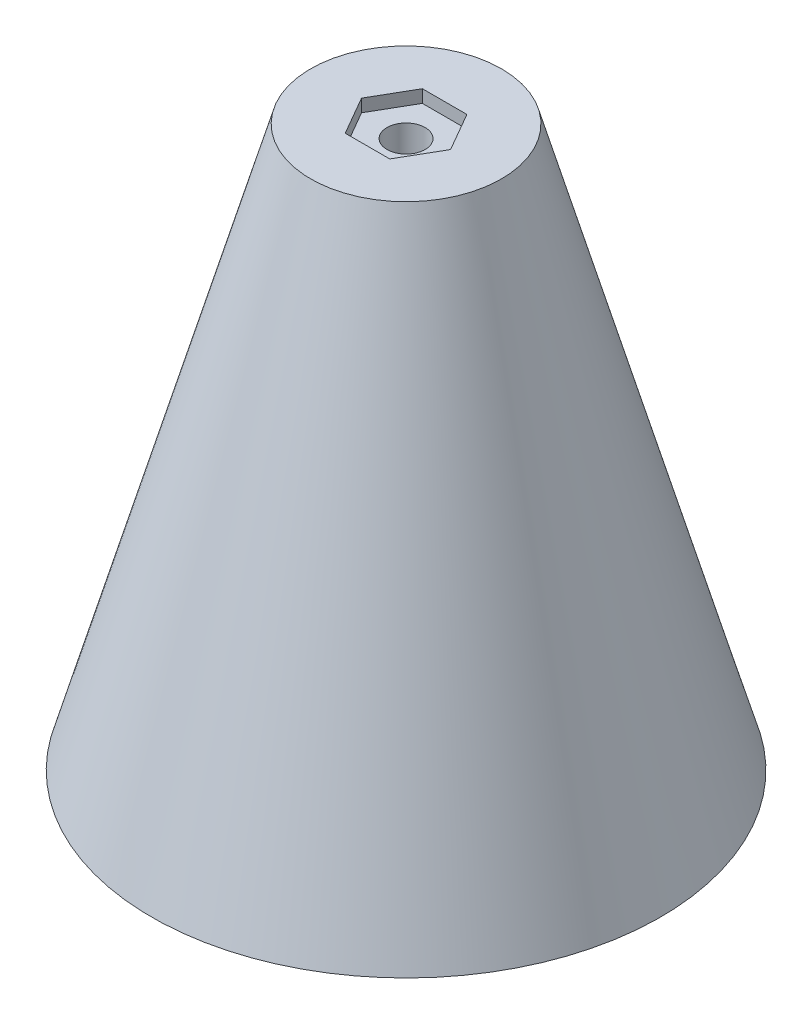
ISO-10303-21;
HEADER;
FILE_DESCRIPTION(('STEP AP214'),'2;1');
FILE_NAME('part.step','',(''),(''),'','','');
FILE_SCHEMA(('AUTOMOTIVE_DESIGN { 1 0 10303 214 1 1 1 1 }'));
ENDSEC;
DATA;
#1=APPLICATION_CONTEXT('core data for automotive mechanical design processes');
#2=APPLICATION_PROTOCOL_DEFINITION('international standard','automotive_design',2000,#1);
#3=PRODUCT_CONTEXT('',#1,'mechanical');
#4=PRODUCT('Part','Part','',(#3));
#5=PRODUCT_RELATED_PRODUCT_CATEGORY('part','',(#4));
#6=PRODUCT_DEFINITION_FORMATION('','',#4);
#7=PRODUCT_DEFINITION_CONTEXT('part definition',#1,'design');
#8=PRODUCT_DEFINITION('design','',#6,#7);
#9=PRODUCT_DEFINITION_SHAPE('','',#8);
#10=(LENGTH_UNIT() NAMED_UNIT(*) SI_UNIT(.MILLI.,.METRE.));
#11=(NAMED_UNIT(*) PLANE_ANGLE_UNIT() SI_UNIT($,.RADIAN.));
#12=(NAMED_UNIT(*) SI_UNIT($,.STERADIAN.) SOLID_ANGLE_UNIT());
#13=UNCERTAINTY_MEASURE_WITH_UNIT(LENGTH_MEASURE(1.E-05),#10,'distance_accuracy_value','');
#14=(GEOMETRIC_REPRESENTATION_CONTEXT(3) GLOBAL_UNCERTAINTY_ASSIGNED_CONTEXT((#13)) GLOBAL_UNIT_ASSIGNED_CONTEXT((#10,
#11,#12)) REPRESENTATION_CONTEXT('',''));
#15=CARTESIAN_POINT('',(0.,0.,0.));
#16=DIRECTION('',(0.,0.,1.));
#17=DIRECTION('',(1.,0.,0.));
#18=AXIS2_PLACEMENT_3D('',#15,#16,#17);
#19=CARTESIAN_POINT('',(0.,-10.,0.));
#20=DIRECTION('',(0.,1.,0.));
#21=DIRECTION('',(0.,0.,1.));
#22=AXIS2_PLACEMENT_3D('',#19,#20,#21);
#23=CYLINDRICAL_SURFACE('',#22,1.5);
#24=CARTESIAN_POINT('',(0.,-3.5,0.));
#25=DIRECTION('',(0.,1.,0.));
#26=DIRECTION('',(0.,0.,1.));
#27=AXIS2_PLACEMENT_3D('',#24,#25,#26);
#28=CIRCLE('',#27,1.5);
#29=CARTESIAN_POINT('',(0.,-3.5,1.5));
#30=VERTEX_POINT('',#29);
#31=EDGE_CURVE('E11',#30,#30,#28,.F.);
#32=ORIENTED_EDGE('',*,*,#31,.T.);
#33=EDGE_LOOP('',(#32));
#34=FACE_BOUND('',#33,.T.);
#35=CARTESIAN_POINT('',(0.,-0.999999999999999,0.));
#36=DIRECTION('',(0.,1.,0.));
#37=DIRECTION('',(0.,0.,1.));
#38=AXIS2_PLACEMENT_3D('',#35,#36,#37);
#39=CIRCLE('',#38,1.5);
#40=CARTESIAN_POINT('',(0.,-0.999999999999999,1.5));
#41=VERTEX_POINT('',#40);
#42=EDGE_CURVE('E42',#41,#41,#39,.F.);
#43=ORIENTED_EDGE('',*,*,#42,.F.);
#44=EDGE_LOOP('',(#43));
#45=FACE_BOUND('',#44,.T.);
#46=ADVANCED_FACE('F37',(#34,#45),#23,.F.);
#47=CARTESIAN_POINT('',(0.,0.,0.));
#48=DIRECTION('',(0.,-1.,0.));
#49=DIRECTION('',(0.,0.,-1.));
#50=AXIS2_PLACEMENT_3D('',#47,#48,#49);
#51=CONICAL_SURFACE('',#50,7.49999999999999,0.27679815863199);
#52=CARTESIAN_POINT('',(0.,-44.,0.));
#53=DIRECTION('',(0.,-1.,0.));
#54=DIRECTION('',(0.,0.,-1.));
#55=AXIS2_PLACEMENT_3D('',#52,#53,#54);
#56=CIRCLE('',#55,20.);
#57=CARTESIAN_POINT('',(0.,-44.,-20.));
#58=VERTEX_POINT('',#57);
#59=EDGE_CURVE('E147',#58,#58,#56,.T.);
#60=ORIENTED_EDGE('',*,*,#59,.F.);
#61=EDGE_LOOP('',(#60));
#62=FACE_BOUND('',#61,.T.);
#63=CARTESIAN_POINT('',(0.,0.,0.));
#64=DIRECTION('',(0.,-1.,0.));
#65=DIRECTION('',(0.,0.,-1.));
#66=AXIS2_PLACEMENT_3D('',#63,#64,#65);
#67=CIRCLE('',#66,7.49999999999999);
#68=CARTESIAN_POINT('',(0.,0.,-7.49999999999998));
#69=VERTEX_POINT('',#68);
#70=EDGE_CURVE('E156',#69,#69,#67,.T.);
#71=ORIENTED_EDGE('',*,*,#70,.T.);
#72=EDGE_LOOP('',(#71));
#73=FACE_BOUND('',#72,.T.);
#74=ADVANCED_FACE('F179',(#62,#73),#51,.T.);
#75=CARTESIAN_POINT('',(0.,0.,7.5));
#76=DIRECTION('',(0.,-1.,0.));
#77=DIRECTION('',(0.,0.,-1.));
#78=AXIS2_PLACEMENT_3D('',#75,#76,#77);
#79=PLANE('',#78);
#80=DIRECTION('',(-0.5,0.,-0.866025403784439));
#81=VECTOR('',#80,1.);
#82=CARTESIAN_POINT('',(3.5,0.,0.));
#83=LINE('',#82,#81);
#84=CARTESIAN_POINT('',(3.5,0.,0.));
#85=VERTEX_POINT('',#84);
#86=CARTESIAN_POINT('',(1.75,0.,-3.03108891324554));
#87=VERTEX_POINT('',#86);
#88=EDGE_CURVE('E129',#85,#87,#83,.T.);
#89=ORIENTED_EDGE('',*,*,#88,.F.);
#90=DIRECTION('',(0.5,0.,-0.866025403784439));
#91=VECTOR('',#90,1.);
#92=CARTESIAN_POINT('',(1.75,0.,3.03108891324554));
#93=LINE('',#92,#91);
#94=CARTESIAN_POINT('',(1.75,0.,3.03108891324554));
#95=VERTEX_POINT('',#94);
#96=EDGE_CURVE('E54',#95,#85,#93,.T.);
#97=ORIENTED_EDGE('',*,*,#96,.F.);
#98=DIRECTION('',(1.,0.,0.));
#99=VECTOR('',#98,1.);
#100=CARTESIAN_POINT('',(-1.75,0.,3.03108891324554));
#101=LINE('',#100,#99);
#102=CARTESIAN_POINT('',(-1.75,0.,3.03108891324554));
#103=VERTEX_POINT('',#102);
#104=EDGE_CURVE('E138',#103,#95,#101,.T.);
#105=ORIENTED_EDGE('',*,*,#104,.F.);
#106=DIRECTION('',(0.5,0.,0.866025403784439));
#107=VECTOR('',#106,1.);
#108=CARTESIAN_POINT('',(-3.5,0.,0.));
#109=LINE('',#108,#107);
#110=CARTESIAN_POINT('',(-3.5,0.,0.));
#111=VERTEX_POINT('',#110);
#112=EDGE_CURVE('E136',#111,#103,#109,.T.);
#113=ORIENTED_EDGE('',*,*,#112,.F.);
#114=DIRECTION('',(-0.5,0.,0.866025403784439));
#115=VECTOR('',#114,1.);
#116=CARTESIAN_POINT('',(-1.75,0.,-3.03108891324554));
#117=LINE('',#116,#115);
#118=CARTESIAN_POINT('',(-1.75,0.,-3.03108891324554));
#119=VERTEX_POINT('',#118);
#120=EDGE_CURVE('E102',#119,#111,#117,.T.);
#121=ORIENTED_EDGE('',*,*,#120,.F.);
#122=DIRECTION('',(-1.,0.,0.));
#123=VECTOR('',#122,1.);
#124=CARTESIAN_POINT('',(1.75,0.,-3.03108891324554));
#125=LINE('',#124,#123);
#126=EDGE_CURVE('E132',#87,#119,#125,.T.);
#127=ORIENTED_EDGE('',*,*,#126,.F.);
#128=EDGE_LOOP('',(#89,#97,#105,#113,#121,#127));
#129=FACE_BOUND('',#128,.T.);
#130=ORIENTED_EDGE('',*,*,#70,.F.);
#131=EDGE_LOOP('',(#130));
#132=FACE_BOUND('',#131,.T.);
#133=ADVANCED_FACE('F185',(#129,#132),#79,.F.);
#134=CARTESIAN_POINT('',(0.,-4.,0.));
#135=DIRECTION('',(0.,1.,0.));
#136=DIRECTION('',(0.,0.,1.));
#137=AXIS2_PLACEMENT_3D('',#134,#135,#136);
#138=PLANE('',#137);
#139=CARTESIAN_POINT('',(0.,-4.,0.));
#140=DIRECTION('',(0.,1.,0.));
#141=DIRECTION('',(0.,0.,1.));
#142=AXIS2_PLACEMENT_3D('',#139,#140,#141);
#143=CIRCLE('',#142,1.99999999999999);
#144=CARTESIAN_POINT('',(0.,-4.,2.));
#145=VERTEX_POINT('',#144);
#146=EDGE_CURVE('E47',#145,#145,#143,.T.);
#147=ORIENTED_EDGE('',*,*,#146,.T.);
#148=EDGE_LOOP('',(#147));
#149=FACE_BOUND('',#148,.T.);
#150=CARTESIAN_POINT('',(0.,-4.,0.));
#151=DIRECTION('',(0.,-1.,0.));
#152=DIRECTION('',(0.,0.,-1.));
#153=AXIS2_PLACEMENT_3D('',#150,#151,#152);
#154=CIRCLE('',#153,4.63636363636363);
#155=CARTESIAN_POINT('',(0.,-4.,-4.63636363636362));
#156=VERTEX_POINT('',#155);
#157=EDGE_CURVE('E153',#156,#156,#154,.T.);
#158=ORIENTED_EDGE('',*,*,#157,.T.);
#159=EDGE_LOOP('',(#158));
#160=FACE_BOUND('',#159,.T.);
#161=ADVANCED_FACE('F162',(#149,#160),#138,.F.);
#162=CARTESIAN_POINT('',(0.,-44.,0.));
#163=DIRECTION('',(0.,-1.,0.));
#164=DIRECTION('',(0.,0.,-1.));
#165=AXIS2_PLACEMENT_3D('',#162,#163,#164);
#166=CONICAL_SURFACE('',#165,16.,0.27679815863199);
#167=CARTESIAN_POINT('',(0.,-44.,0.));
#168=DIRECTION('',(0.,-1.,0.));
#169=DIRECTION('',(0.,0.,-1.));
#170=AXIS2_PLACEMENT_3D('',#167,#168,#169);
#171=CIRCLE('',#170,16.);
#172=CARTESIAN_POINT('',(0.,-44.,-16.));
#173=VERTEX_POINT('',#172);
#174=EDGE_CURVE('E150',#173,#173,#171,.T.);
#175=CARTESIAN_POINT('',(0.,-4.,-4.63636363636362));
#176=CARTESIAN_POINT('',(0.,-4.41666666666667,-4.75473484848483));
#177=CARTESIAN_POINT('',(0.,-4.83333333333334,-4.87310606060604));
#178=CARTESIAN_POINT('',(0.,-5.66666666666667,-5.10984848484847));
#179=CARTESIAN_POINT('',(0.,-6.08333333333334,-5.22821969696968));
#180=CARTESIAN_POINT('',(0.,-6.91666666666667,-5.4649621212121));
#181=CARTESIAN_POINT('',(0.,-7.33333333333333,-5.58333333333332));
#182=CARTESIAN_POINT('',(0.,-8.16666666666667,-5.82007575757574));
#183=CARTESIAN_POINT('',(0.,-8.58333333333333,-5.93844696969695));
#184=CARTESIAN_POINT('',(0.,-9.41666666666667,-6.17518939393937));
#185=CARTESIAN_POINT('',(0.,-9.83333333333333,-6.29356060606059));
#186=CARTESIAN_POINT('',(0.,-10.6666666666667,-6.53030303030301));
#187=CARTESIAN_POINT('',(0.,-11.0833333333333,-6.64867424242422));
#188=CARTESIAN_POINT('',(0.,-11.9166666666667,-6.88541666666665));
#189=CARTESIAN_POINT('',(0.,-12.3333333333333,-7.00378787878786));
#190=CARTESIAN_POINT('',(0.,-13.1666666666667,-7.24053030303028));
#191=CARTESIAN_POINT('',(0.,-13.5833333333333,-7.35890151515149));
#192=CARTESIAN_POINT('',(0.,-14.4166666666667,-7.59564393939392));
#193=CARTESIAN_POINT('',(0.,-14.8333333333333,-7.71401515151513));
#194=CARTESIAN_POINT('',(0.,-15.6666666666667,-7.95075757575755));
#195=CARTESIAN_POINT('',(0.,-16.0833333333333,-8.06912878787876));
#196=CARTESIAN_POINT('',(0.,-16.9166666666667,-8.30587121212119));
#197=CARTESIAN_POINT('',(0.,-17.3333333333333,-8.4242424242424));
#198=CARTESIAN_POINT('',(0.,-18.1666666666667,-8.66098484848482));
#199=CARTESIAN_POINT('',(0.,-18.5833333333333,-8.77935606060604));
#200=CARTESIAN_POINT('',(0.,-19.4166666666667,-9.01609848484846));
#201=CARTESIAN_POINT('',(0.,-19.8333333333333,-9.13446969696967));
#202=CARTESIAN_POINT('',(0.,-20.6666666666667,-9.37121212121209));
#203=CARTESIAN_POINT('',(0.,-21.0833333333333,-9.48958333333331));
#204=CARTESIAN_POINT('',(0.,-21.9166666666667,-9.72632575757573));
#205=CARTESIAN_POINT('',(0.,-22.3333333333333,-9.84469696969694));
#206=CARTESIAN_POINT('',(0.,-23.1666666666667,-10.0814393939394));
#207=CARTESIAN_POINT('',(0.,-23.5833333333333,-10.1998106060606));
#208=CARTESIAN_POINT('',(0.,-24.4166666666667,-10.436553030303));
#209=CARTESIAN_POINT('',(0.,-24.8333333333333,-10.5549242424242));
#210=CARTESIAN_POINT('',(0.,-25.6666666666667,-10.7916666666666));
#211=CARTESIAN_POINT('',(0.,-26.0833333333333,-10.9100378787878));
#212=CARTESIAN_POINT('',(0.,-26.9166666666667,-11.1467803030303));
#213=CARTESIAN_POINT('',(0.,-27.3333333333333,-11.2651515151515));
#214=CARTESIAN_POINT('',(0.,-28.1666666666667,-11.5018939393939));
#215=CARTESIAN_POINT('',(0.,-28.5833333333333,-11.6202651515151));
#216=CARTESIAN_POINT('',(0.,-29.4166666666667,-11.8570075757575));
#217=CARTESIAN_POINT('',(0.,-29.8333333333333,-11.9753787878788));
#218=CARTESIAN_POINT('',(0.,-30.6666666666667,-12.2121212121212));
#219=CARTESIAN_POINT('',(0.,-31.0833333333333,-12.3304924242424));
#220=CARTESIAN_POINT('',(0.,-31.9166666666667,-12.5672348484848));
#221=CARTESIAN_POINT('',(0.,-32.3333333333333,-12.685606060606));
#222=CARTESIAN_POINT('',(0.,-33.1666666666667,-12.9223484848484));
#223=CARTESIAN_POINT('',(0.,-33.5833333333333,-13.0407196969697));
#224=CARTESIAN_POINT('',(0.,-34.4166666666667,-13.2774621212121));
#225=CARTESIAN_POINT('',(0.,-34.8333333333333,-13.3958333333333));
#226=CARTESIAN_POINT('',(0.,-35.6666666666667,-13.6325757575757));
#227=CARTESIAN_POINT('',(0.,-36.0833333333333,-13.7509469696969));
#228=CARTESIAN_POINT('',(0.,-36.9166666666667,-13.9876893939394));
#229=CARTESIAN_POINT('',(0.,-37.3333333333333,-14.1060606060606));
#230=CARTESIAN_POINT('',(0.,-38.1666666666667,-14.342803030303));
#231=CARTESIAN_POINT('',(0.,-38.5833333333333,-14.4611742424242));
#232=CARTESIAN_POINT('',(0.,-39.4166666666667,-14.6979166666666));
#233=CARTESIAN_POINT('',(0.,-39.8333333333333,-14.8162878787878));
#234=CARTESIAN_POINT('',(0.,-40.6666666666667,-15.0530303030303));
#235=CARTESIAN_POINT('',(0.,-41.0833333333333,-15.1714015151515));
#236=CARTESIAN_POINT('',(0.,-41.9166666666667,-15.4081439393939));
#237=CARTESIAN_POINT('',(0.,-42.3333333333333,-15.5265151515151));
#238=CARTESIAN_POINT('',(0.,-43.1666666666667,-15.7632575757575));
#239=CARTESIAN_POINT('',(0.,-43.5833333333333,-15.8816287878787));
#240=CARTESIAN_POINT('',(0.,-44.,-16.));
#241=B_SPLINE_CURVE_WITH_KNOTS('',3,(#175,#176,#177,#178,#179,#180,#181,#182,#183,#184,#185,
#186,#187,#188,#189,#190,#191,#192,#193,#194,#195,#196,#197,#198,#199,#200,#201,#202,#203,#204,
#205,#206,#207,#208,#209,#210,#211,#212,#213,#214,#215,#216,#217,#218,#219,#220,#221,#222,#223,
#224,#225,#226,#227,#228,#229,#230,#231,#232,#233,#234,#235,#236,#237,#238,#239,#240),
.UNSPECIFIED.,.F.,.F.,(4,2,2,2,2,2,2,2,2,2,2,2,2,2,2,2,2,2,2,2,2,2,2,2,2,2,2,2,2,2,2,2,4),(0.,
1.29946361808687,2.59892723617373,3.89839085426059,5.19785447234746,6.49731809043432,
7.79678170852119,9.09624532660805,10.3957089446949,11.6951725627818,12.9946361808686,
14.2940997989555,15.5935634170424,16.8930270351292,18.1924906532161,19.491954271303,
20.7914178893898,22.0908815074767,23.3903451255636,24.6898087436504,25.9892723617373,
27.2887359798242,28.588199597911,29.8876632159979,31.1871268340847,32.4865904521716,
33.7860540702585,35.0855176883453,36.3849813064322,37.6844449245191,38.9839085426059,
40.2833721606928,41.5828357787797),.UNSPECIFIED.);
#242=EDGE_CURVE('BSEAM174',#156,#173,#241,.T.);
#243=ORIENTED_EDGE('',*,*,#157,.F.);
#244=ORIENTED_EDGE('',*,*,#174,.T.);
#245=ORIENTED_EDGE('',*,*,#242,.T.);
#246=ORIENTED_EDGE('',*,*,#242,.F.);
#247=EDGE_LOOP('',(#243,#245,#244,#246));
#248=FACE_BOUND('',#247,.T.);
#249=ADVANCED_FACE('F174',(#248),#166,.F.);
#250=CARTESIAN_POINT('',(0.,-44.,16.));
#251=DIRECTION('',(0.,1.,0.));
#252=DIRECTION('',(0.,0.,1.));
#253=AXIS2_PLACEMENT_3D('',#250,#251,#252);
#254=PLANE('',#253);
#255=ORIENTED_EDGE('',*,*,#174,.F.);
#256=EDGE_LOOP('',(#255));
#257=FACE_BOUND('',#256,.T.);
#258=ORIENTED_EDGE('',*,*,#59,.T.);
#259=EDGE_LOOP('',(#258));
#260=FACE_BOUND('',#259,.T.);
#261=ADVANCED_FACE('F166',(#257,#260),#254,.F.);
#262=CARTESIAN_POINT('',(0.,-4.,0.));
#263=DIRECTION('',(0.,-1.,0.));
#264=DIRECTION('',(0.,0.,-1.));
#265=AXIS2_PLACEMENT_3D('',#262,#263,#264);
#266=CONICAL_SURFACE('',#265,1.99999999999999,0.78539816339744);
#267=ORIENTED_EDGE('',*,*,#31,.F.);
#268=EDGE_LOOP('',(#267));
#269=FACE_BOUND('',#268,.T.);
#270=ORIENTED_EDGE('',*,*,#146,.F.);
#271=EDGE_LOOP('',(#270));
#272=FACE_BOUND('',#271,.T.);
#273=ADVANCED_FACE('F40',(#269,#272),#266,.F.);
#274=CARTESIAN_POINT('',(0.,-1.,0.));
#275=DIRECTION('',(0.,1.,0.));
#276=DIRECTION('',(0.,0.,1.));
#277=AXIS2_PLACEMENT_3D('',#274,#275,#276);
#278=PLANE('',#277);
#279=DIRECTION('',(0.5,0.,-0.866025403784439));
#280=VECTOR('',#279,1.);
#281=CARTESIAN_POINT('',(1.75,-0.999999999999999,3.03108891324554));
#282=LINE('',#281,#280);
#283=CARTESIAN_POINT('',(1.75,-0.999999999999999,3.03108891324554));
#284=VERTEX_POINT('',#283);
#285=CARTESIAN_POINT('',(3.5,-1.,0.));
#286=VERTEX_POINT('',#285);
#287=EDGE_CURVE('E140',#284,#286,#282,.T.);
#288=ORIENTED_EDGE('',*,*,#287,.T.);
#289=DIRECTION('',(-0.5,0.,-0.866025403784439));
#290=VECTOR('',#289,1.);
#291=CARTESIAN_POINT('',(3.5,-1.,0.));
#292=LINE('',#291,#290);
#293=CARTESIAN_POINT('',(1.75,-1.,-3.03108891324554));
#294=VERTEX_POINT('',#293);
#295=EDGE_CURVE('E123',#286,#294,#292,.T.);
#296=ORIENTED_EDGE('',*,*,#295,.T.);
#297=DIRECTION('',(-1.,0.,0.));
#298=VECTOR('',#297,1.);
#299=CARTESIAN_POINT('',(1.75,-1.,-3.03108891324554));
#300=LINE('',#299,#298);
#301=CARTESIAN_POINT('',(-1.75,-1.,-3.03108891324554));
#302=VERTEX_POINT('',#301);
#303=EDGE_CURVE('E121',#294,#302,#300,.T.);
#304=ORIENTED_EDGE('',*,*,#303,.T.);
#305=DIRECTION('',(-0.5,0.,0.866025403784439));
#306=VECTOR('',#305,1.);
#307=CARTESIAN_POINT('',(-1.75,-1.,-3.03108891324554));
#308=LINE('',#307,#306);
#309=CARTESIAN_POINT('',(-3.5,-1.,0.));
#310=VERTEX_POINT('',#309);
#311=EDGE_CURVE('E99',#302,#310,#308,.T.);
#312=ORIENTED_EDGE('',*,*,#311,.T.);
#313=DIRECTION('',(0.5,0.,0.866025403784439));
#314=VECTOR('',#313,1.);
#315=CARTESIAN_POINT('',(-3.5,-1.,0.));
#316=LINE('',#315,#314);
#317=CARTESIAN_POINT('',(-1.75,-0.999999999999999,3.03108891324554));
#318=VERTEX_POINT('',#317);
#319=EDGE_CURVE('E110',#310,#318,#316,.T.);
#320=ORIENTED_EDGE('',*,*,#319,.T.);
#321=DIRECTION('',(1.,0.,0.));
#322=VECTOR('',#321,1.);
#323=CARTESIAN_POINT('',(-1.75,-0.999999999999999,3.03108891324554));
#324=LINE('',#323,#322);
#325=EDGE_CURVE('E114',#318,#284,#324,.T.);
#326=ORIENTED_EDGE('',*,*,#325,.T.);
#327=EDGE_LOOP('',(#288,#296,#304,#312,#320,#326));
#328=FACE_BOUND('',#327,.T.);
#329=ORIENTED_EDGE('',*,*,#42,.T.);
#330=EDGE_LOOP('',(#329));
#331=FACE_BOUND('',#330,.T.);
#332=ADVANCED_FACE('F117',(#328,#331),#278,.T.);
#333=CARTESIAN_POINT('',(1.75,-0.999999999999999,3.03108891324554));
#334=DIRECTION('',(0.866025403784439,0.,0.5));
#335=DIRECTION('',(0.5,0.,-0.866025403784439));
#336=AXIS2_PLACEMENT_3D('',#333,#334,#335);
#337=PLANE('',#336);
#338=ORIENTED_EDGE('',*,*,#96,.T.);
#339=DIRECTION('',(0.,1.,0.));
#340=VECTOR('',#339,1.);
#341=CARTESIAN_POINT('',(3.5,-1.,0.));
#342=LINE('',#341,#340);
#343=EDGE_CURVE('E84',#286,#85,#342,.T.);
#344=ORIENTED_EDGE('',*,*,#343,.F.);
#345=ORIENTED_EDGE('',*,*,#287,.F.);
#346=DIRECTION('',(0.,1.,0.));
#347=VECTOR('',#346,1.);
#348=CARTESIAN_POINT('',(1.75,-0.999999999999999,3.03108891324554));
#349=LINE('',#348,#347);
#350=EDGE_CURVE('E62',#284,#95,#349,.T.);
#351=ORIENTED_EDGE('',*,*,#350,.T.);
#352=EDGE_LOOP('',(#338,#344,#345,#351));
#353=FACE_BOUND('',#352,.T.);
#354=ADVANCED_FACE('F172',(#353),#337,.F.);
#355=CARTESIAN_POINT('',(-1.75,-0.999999999999999,3.03108891324554));
#356=DIRECTION('',(0.,0.,1.));
#357=DIRECTION('',(0.,-1.,0.));
#358=AXIS2_PLACEMENT_3D('',#355,#356,#357);
#359=PLANE('',#358);
#360=ORIENTED_EDGE('',*,*,#104,.T.);
#361=ORIENTED_EDGE('',*,*,#350,.F.);
#362=ORIENTED_EDGE('',*,*,#325,.F.);
#363=DIRECTION('',(0.,1.,0.));
#364=VECTOR('',#363,1.);
#365=CARTESIAN_POINT('',(-1.75,-0.999999999999999,3.03108891324554));
#366=LINE('',#365,#364);
#367=EDGE_CURVE('E106',#318,#103,#366,.T.);
#368=ORIENTED_EDGE('',*,*,#367,.T.);
#369=EDGE_LOOP('',(#360,#361,#362,#368));
#370=FACE_BOUND('',#369,.T.);
#371=ADVANCED_FACE('F210',(#370),#359,.F.);
#372=CARTESIAN_POINT('',(-3.5,-1.,0.));
#373=DIRECTION('',(-0.866025403784439,0.,0.5));
#374=DIRECTION('',(0.5,0.,0.866025403784439));
#375=AXIS2_PLACEMENT_3D('',#372,#373,#374);
#376=PLANE('',#375);
#377=ORIENTED_EDGE('',*,*,#112,.T.);
#378=ORIENTED_EDGE('',*,*,#367,.F.);
#379=ORIENTED_EDGE('',*,*,#319,.F.);
#380=DIRECTION('',(0.,1.,0.));
#381=VECTOR('',#380,1.);
#382=CARTESIAN_POINT('',(-3.5,-1.,0.));
#383=LINE('',#382,#381);
#384=EDGE_CURVE('E95',#310,#111,#383,.T.);
#385=ORIENTED_EDGE('',*,*,#384,.T.);
#386=EDGE_LOOP('',(#377,#378,#379,#385));
#387=FACE_BOUND('',#386,.T.);
#388=ADVANCED_FACE('F111',(#387),#376,.F.);
#389=CARTESIAN_POINT('',(-1.75,-1.,-3.03108891324554));
#390=DIRECTION('',(-0.866025403784439,0.,-0.5));
#391=DIRECTION('',(-0.5,0.,0.866025403784439));
#392=AXIS2_PLACEMENT_3D('',#389,#390,#391);
#393=PLANE('',#392);
#394=ORIENTED_EDGE('',*,*,#120,.T.);
#395=ORIENTED_EDGE('',*,*,#384,.F.);
#396=ORIENTED_EDGE('',*,*,#311,.F.);
#397=DIRECTION('',(0.,1.,0.));
#398=VECTOR('',#397,1.);
#399=CARTESIAN_POINT('',(-1.75,-1.,-3.03108891324554));
#400=LINE('',#399,#398);
#401=EDGE_CURVE('E107',#302,#119,#400,.T.);
#402=ORIENTED_EDGE('',*,*,#401,.T.);
#403=EDGE_LOOP('',(#394,#395,#396,#402));
#404=FACE_BOUND('',#403,.T.);
#405=ADVANCED_FACE('F97',(#404),#393,.F.);
#406=CARTESIAN_POINT('',(1.75,-1.,-3.03108891324554));
#407=DIRECTION('',(0.,0.,-1.));
#408=DIRECTION('',(0.,1.,0.));
#409=AXIS2_PLACEMENT_3D('',#406,#407,#408);
#410=PLANE('',#409);
#411=ORIENTED_EDGE('',*,*,#126,.T.);
#412=ORIENTED_EDGE('',*,*,#401,.F.);
#413=ORIENTED_EDGE('',*,*,#303,.F.);
#414=DIRECTION('',(0.,1.,0.));
#415=VECTOR('',#414,1.);
#416=CARTESIAN_POINT('',(1.75,-1.,-3.03108891324554));
#417=LINE('',#416,#415);
#418=EDGE_CURVE('E144',#294,#87,#417,.T.);
#419=ORIENTED_EDGE('',*,*,#418,.T.);
#420=EDGE_LOOP('',(#411,#412,#413,#419));
#421=FACE_BOUND('',#420,.T.);
#422=ADVANCED_FACE('F222',(#421),#410,.F.);
#423=CARTESIAN_POINT('',(3.5,-1.,0.));
#424=DIRECTION('',(0.866025403784439,0.,-0.5));
#425=DIRECTION('',(-0.5,0.,-0.866025403784439));
#426=AXIS2_PLACEMENT_3D('',#423,#424,#425);
#427=PLANE('',#426);
#428=ORIENTED_EDGE('',*,*,#88,.T.);
#429=ORIENTED_EDGE('',*,*,#418,.F.);
#430=ORIENTED_EDGE('',*,*,#295,.F.);
#431=ORIENTED_EDGE('',*,*,#343,.T.);
#432=EDGE_LOOP('',(#428,#429,#430,#431));
#433=FACE_BOUND('',#432,.T.);
#434=ADVANCED_FACE('F207',(#433),#427,.F.);
#435=CLOSED_SHELL('',(#46,#74,#133,#161,#249,#261,#273,#332,#354,#371,#388,#405,#422,#434));
#436=MANIFOLD_SOLID_BREP('B2',#435);
#437=ADVANCED_BREP_SHAPE_REPRESENTATION('',(#18,#436),#14);
#438=SHAPE_DEFINITION_REPRESENTATION(#9,#437);
ENDSEC;
END-ISO-10303-21;
